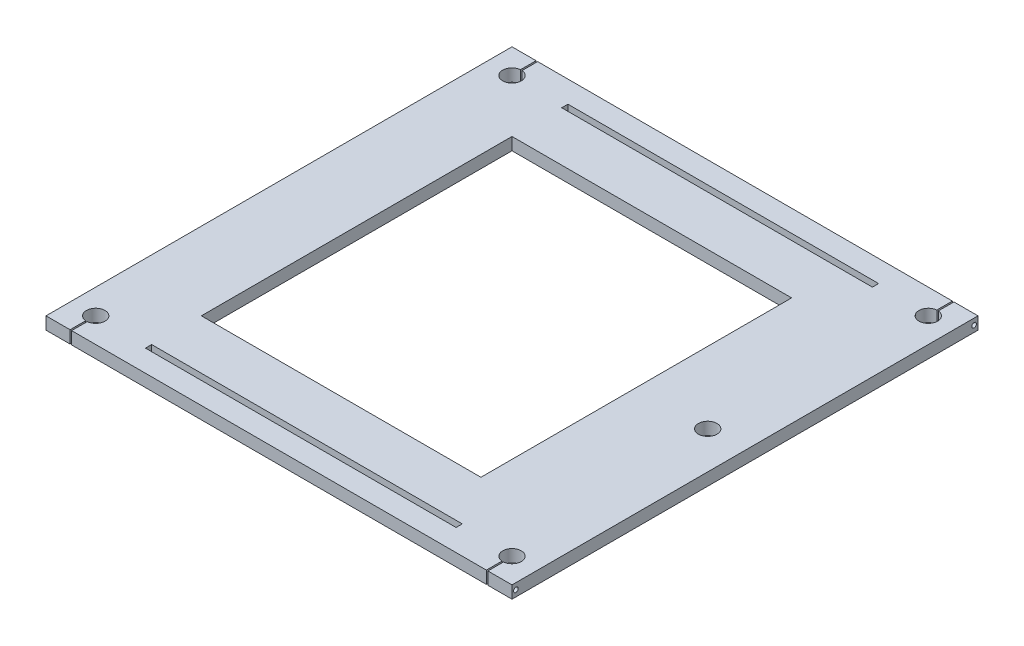
ISO-10303-21;
HEADER;
FILE_DESCRIPTION(('STEP AP214'),'2;1');
FILE_NAME('part.step','',(''),(''),'','','');
FILE_SCHEMA(('AUTOMOTIVE_DESIGN { 1 0 10303 214 1 1 1 1 }'));
ENDSEC;
DATA;
#1=APPLICATION_CONTEXT('core data for automotive mechanical design processes');
#2=APPLICATION_PROTOCOL_DEFINITION('international standard','automotive_design',2000,#1);
#3=PRODUCT_CONTEXT('',#1,'mechanical');
#4=PRODUCT('Part','Part','',(#3));
#5=PRODUCT_RELATED_PRODUCT_CATEGORY('part','',(#4));
#6=PRODUCT_DEFINITION_FORMATION('','',#4);
#7=PRODUCT_DEFINITION_CONTEXT('part definition',#1,'design');
#8=PRODUCT_DEFINITION('design','',#6,#7);
#9=PRODUCT_DEFINITION_SHAPE('','',#8);
#10=(LENGTH_UNIT() NAMED_UNIT(*) SI_UNIT(.MILLI.,.METRE.));
#11=(NAMED_UNIT(*) PLANE_ANGLE_UNIT() SI_UNIT($,.RADIAN.));
#12=(NAMED_UNIT(*) SI_UNIT($,.STERADIAN.) SOLID_ANGLE_UNIT());
#13=UNCERTAINTY_MEASURE_WITH_UNIT(LENGTH_MEASURE(1.E-05),#10,'distance_accuracy_value','');
#14=(GEOMETRIC_REPRESENTATION_CONTEXT(3) GLOBAL_UNCERTAINTY_ASSIGNED_CONTEXT((#13)) GLOBAL_UNIT_ASSIGNED_CONTEXT((#10,
#11,#12)) REPRESENTATION_CONTEXT('',''));
#15=CARTESIAN_POINT('',(0.,0.,0.));
#16=DIRECTION('',(0.,0.,1.));
#17=DIRECTION('',(1.,0.,0.));
#18=AXIS2_PLACEMENT_3D('',#15,#16,#17);
#19=CARTESIAN_POINT('',(0.,8.,0.));
#20=DIRECTION('',(0.,-1.,0.));
#21=DIRECTION('',(0.,0.,-1.));
#22=AXIS2_PLACEMENT_3D('',#19,#20,#21);
#23=PLANE('',#22);
#24=DIRECTION('',(1.,0.,0.));
#25=VECTOR('',#24,1.);
#26=CARTESIAN_POINT('',(-99.9999999999999,8.,132.));
#27=LINE('',#26,#25);
#28=CARTESIAN_POINT('',(-99.9999999999999,8.,132.));
#29=VERTEX_POINT('',#28);
#30=CARTESIAN_POINT('',(100.,8.,132.));
#31=VERTEX_POINT('',#30);
#32=EDGE_CURVE('E248',#29,#31,#27,.T.);
#33=ORIENTED_EDGE('',*,*,#32,.T.);
#34=DIRECTION('',(0.,0.,1.));
#35=VECTOR('',#34,1.);
#36=CARTESIAN_POINT('',(100.,8.,136.));
#37=LINE('',#36,#35);
#38=CARTESIAN_POINT('',(100.,8.,136.));
#39=VERTEX_POINT('',#38);
#40=EDGE_CURVE('E255',#31,#39,#37,.T.);
#41=ORIENTED_EDGE('',*,*,#40,.T.);
#42=DIRECTION('',(-1.,0.,0.));
#43=VECTOR('',#42,1.);
#44=CARTESIAN_POINT('',(-99.9999999999999,8.,136.));
#45=LINE('',#44,#43);
#46=CARTESIAN_POINT('',(-99.9999999999999,8.,136.));
#47=VERTEX_POINT('',#46);
#48=EDGE_CURVE('E265',#39,#47,#45,.T.);
#49=ORIENTED_EDGE('',*,*,#48,.T.);
#50=DIRECTION('',(0.,0.,-1.));
#51=VECTOR('',#50,1.);
#52=CARTESIAN_POINT('',(-99.9999999999999,8.,136.));
#53=LINE('',#52,#51);
#54=EDGE_CURVE('E50',#47,#29,#53,.T.);
#55=ORIENTED_EDGE('',*,*,#54,.T.);
#56=EDGE_LOOP('',(#33,#41,#49,#55));
#57=FACE_BOUND('',#56,.T.);
#58=DIRECTION('',(0.,0.,-1.));
#59=VECTOR('',#58,1.);
#60=CARTESIAN_POINT('',(-133.5,8.,150.));
#61=LINE('',#60,#59);
#62=CARTESIAN_POINT('',(-133.5,8.,150.));
#63=VERTEX_POINT('',#62);
#64=CARTESIAN_POINT('',(-133.5,8.,139.979130371551));
#65=VERTEX_POINT('',#64);
#66=EDGE_CURVE('E313',#63,#65,#61,.T.);
#67=ORIENTED_EDGE('',*,*,#66,.F.);
#68=DIRECTION('',(1.,0.,0.));
#69=VECTOR('',#68,1.);
#70=CARTESIAN_POINT('',(-150.,8.,150.));
#71=LINE('',#70,#69);
#72=CARTESIAN_POINT('',(133.5,8.,150.));
#73=VERTEX_POINT('',#72);
#74=EDGE_CURVE('E478',#63,#73,#71,.T.);
#75=ORIENTED_EDGE('',*,*,#74,.T.);
#76=DIRECTION('',(0.,0.,-1.));
#77=VECTOR('',#76,1.);
#78=CARTESIAN_POINT('',(133.5,8.,150.));
#79=LINE('',#78,#77);
#80=CARTESIAN_POINT('',(133.5,8.,139.979130371551));
#81=VERTEX_POINT('',#80);
#82=EDGE_CURVE('E378',#73,#81,#79,.T.);
#83=ORIENTED_EDGE('',*,*,#82,.T.);
#84=CARTESIAN_POINT('',(134.,8.,134.));
#85=DIRECTION('',(0.,-1.,0.));
#86=DIRECTION('',(0.,0.,-1.));
#87=AXIS2_PLACEMENT_3D('',#84,#85,#86);
#88=CIRCLE('',#87,6.00000000000001);
#89=CARTESIAN_POINT('',(134.5,8.,139.979130371551));
#90=VERTEX_POINT('',#89);
#91=EDGE_CURVE('E385',#81,#90,#88,.T.);
#92=ORIENTED_EDGE('',*,*,#91,.T.);
#93=DIRECTION('',(0.,0.,1.));
#94=VECTOR('',#93,1.);
#95=CARTESIAN_POINT('',(134.5,8.,150.));
#96=LINE('',#95,#94);
#97=CARTESIAN_POINT('',(134.5,8.,150.));
#98=VERTEX_POINT('',#97);
#99=EDGE_CURVE('E381',#90,#98,#96,.T.);
#100=ORIENTED_EDGE('',*,*,#99,.T.);
#101=CARTESIAN_POINT('',(150.,8.,150.));
#102=VERTEX_POINT('',#101);
#103=EDGE_CURVE('E473',#98,#102,#71,.T.);
#104=ORIENTED_EDGE('',*,*,#103,.T.);
#105=DIRECTION('',(0.,0.,-1.));
#106=VECTOR('',#105,1.);
#107=CARTESIAN_POINT('',(150.,8.,-150.));
#108=LINE('',#107,#106);
#109=CARTESIAN_POINT('',(150.,8.,-150.));
#110=VERTEX_POINT('',#109);
#111=EDGE_CURVE('E477',#102,#110,#108,.T.);
#112=ORIENTED_EDGE('',*,*,#111,.T.);
#113=DIRECTION('',(-1.,0.,0.));
#114=VECTOR('',#113,1.);
#115=CARTESIAN_POINT('',(-150.,8.,-150.));
#116=LINE('',#115,#114);
#117=CARTESIAN_POINT('',(134.5,8.,-150.));
#118=VERTEX_POINT('',#117);
#119=EDGE_CURVE('E466',#110,#118,#116,.T.);
#120=ORIENTED_EDGE('',*,*,#119,.T.);
#121=DIRECTION('',(0.,0.,-1.));
#122=VECTOR('',#121,1.);
#123=CARTESIAN_POINT('',(134.5,8.,-150.));
#124=LINE('',#123,#122);
#125=CARTESIAN_POINT('',(134.5,8.,-139.979130371551));
#126=VERTEX_POINT('',#125);
#127=EDGE_CURVE('E414',#126,#118,#124,.T.);
#128=ORIENTED_EDGE('',*,*,#127,.F.);
#129=CARTESIAN_POINT('',(134.,8.,-134.));
#130=DIRECTION('',(0.,1.,0.));
#131=DIRECTION('',(0.,0.,1.));
#132=AXIS2_PLACEMENT_3D('',#129,#130,#131);
#133=CIRCLE('',#132,6.00000000000001);
#134=CARTESIAN_POINT('',(133.5,8.,-139.979130371551));
#135=VERTEX_POINT('',#134);
#136=EDGE_CURVE('E411',#135,#126,#133,.T.);
#137=ORIENTED_EDGE('',*,*,#136,.F.);
#138=DIRECTION('',(0.,0.,1.));
#139=VECTOR('',#138,1.);
#140=CARTESIAN_POINT('',(133.5,8.,-150.));
#141=LINE('',#140,#139);
#142=CARTESIAN_POINT('',(133.5,8.,-150.));
#143=VERTEX_POINT('',#142);
#144=EDGE_CURVE('E409',#143,#135,#141,.T.);
#145=ORIENTED_EDGE('',*,*,#144,.F.);
#146=CARTESIAN_POINT('',(-133.5,8.,-150.));
#147=VERTEX_POINT('',#146);
#148=EDGE_CURVE('E470',#143,#147,#116,.T.);
#149=ORIENTED_EDGE('',*,*,#148,.T.);
#150=DIRECTION('',(0.,0.,1.));
#151=VECTOR('',#150,1.);
#152=CARTESIAN_POINT('',(-133.5,8.,-150.));
#153=LINE('',#152,#151);
#154=CARTESIAN_POINT('',(-133.5,8.,-139.979130371551));
#155=VERTEX_POINT('',#154);
#156=EDGE_CURVE('E342',#147,#155,#153,.T.);
#157=ORIENTED_EDGE('',*,*,#156,.T.);
#158=CARTESIAN_POINT('',(-134.,8.,-134.));
#159=DIRECTION('',(0.,-1.,0.));
#160=DIRECTION('',(0.,0.,1.));
#161=AXIS2_PLACEMENT_3D('',#158,#159,#160);
#162=CIRCLE('',#161,6.00000000000001);
#163=CARTESIAN_POINT('',(-134.5,8.,-139.979130371551));
#164=VERTEX_POINT('',#163);
#165=EDGE_CURVE('E349',#155,#164,#162,.T.);
#166=ORIENTED_EDGE('',*,*,#165,.T.);
#167=DIRECTION('',(0.,0.,-1.));
#168=VECTOR('',#167,1.);
#169=CARTESIAN_POINT('',(-134.5,8.,-150.));
#170=LINE('',#169,#168);
#171=CARTESIAN_POINT('',(-134.5,8.,-150.));
#172=VERTEX_POINT('',#171);
#173=EDGE_CURVE('E345',#164,#172,#170,.T.);
#174=ORIENTED_EDGE('',*,*,#173,.T.);
#175=CARTESIAN_POINT('',(-150.,8.,-150.));
#176=VERTEX_POINT('',#175);
#177=EDGE_CURVE('E471',#172,#176,#116,.T.);
#178=ORIENTED_EDGE('',*,*,#177,.T.);
#179=DIRECTION('',(0.,0.,1.));
#180=VECTOR('',#179,1.);
#181=CARTESIAN_POINT('',(-150.,8.,150.));
#182=LINE('',#181,#180);
#183=CARTESIAN_POINT('',(-150.,8.,150.));
#184=VERTEX_POINT('',#183);
#185=EDGE_CURVE('E469',#176,#184,#182,.T.);
#186=ORIENTED_EDGE('',*,*,#185,.T.);
#187=CARTESIAN_POINT('',(-134.5,8.,150.));
#188=VERTEX_POINT('',#187);
#189=EDGE_CURVE('E474',#184,#188,#71,.T.);
#190=ORIENTED_EDGE('',*,*,#189,.T.);
#191=DIRECTION('',(0.,0.,1.));
#192=VECTOR('',#191,1.);
#193=CARTESIAN_POINT('',(-134.5,8.,150.));
#194=LINE('',#193,#192);
#195=CARTESIAN_POINT('',(-134.5,8.,139.979130371551));
#196=VERTEX_POINT('',#195);
#197=EDGE_CURVE('E318',#196,#188,#194,.T.);
#198=ORIENTED_EDGE('',*,*,#197,.F.);
#199=CARTESIAN_POINT('',(-134.,8.,134.));
#200=DIRECTION('',(0.,1.,0.));
#201=DIRECTION('',(0.,0.,-1.));
#202=AXIS2_PLACEMENT_3D('',#199,#200,#201);
#203=CIRCLE('',#202,6.00000000000001);
#204=EDGE_CURVE('E315',#65,#196,#203,.T.);
#205=ORIENTED_EDGE('',*,*,#204,.F.);
#206=EDGE_LOOP('',(#67,#75,#83,#92,#100,#104,#112,#120,#128,#137,#145,#149,#157,#166,#174,#178,
#186,#190,#198,#205));
#207=FACE_BOUND('',#206,.T.);
#208=DIRECTION('',(0.,0.,-1.));
#209=VECTOR('',#208,1.);
#210=CARTESIAN_POINT('',(80.,8.,100.));
#211=LINE('',#210,#209);
#212=CARTESIAN_POINT('',(80.,8.,100.));
#213=VERTEX_POINT('',#212);
#214=CARTESIAN_POINT('',(80.,8.,-100.));
#215=VERTEX_POINT('',#214);
#216=EDGE_CURVE('E435',#213,#215,#211,.T.);
#217=ORIENTED_EDGE('',*,*,#216,.F.);
#218=DIRECTION('',(1.,0.,0.));
#219=VECTOR('',#218,1.);
#220=CARTESIAN_POINT('',(-99.9999999999999,8.,100.));
#221=LINE('',#220,#219);
#222=CARTESIAN_POINT('',(-99.9999999999999,8.,100.));
#223=VERTEX_POINT('',#222);
#224=EDGE_CURVE('E443',#223,#213,#221,.T.);
#225=ORIENTED_EDGE('',*,*,#224,.F.);
#226=DIRECTION('',(0.,0.,1.));
#227=VECTOR('',#226,1.);
#228=CARTESIAN_POINT('',(-99.9999999999999,8.,100.));
#229=LINE('',#228,#227);
#230=CARTESIAN_POINT('',(-99.9999999999999,8.,-100.));
#231=VERTEX_POINT('',#230);
#232=EDGE_CURVE('E440',#231,#223,#229,.T.);
#233=ORIENTED_EDGE('',*,*,#232,.F.);
#234=DIRECTION('',(-1.,0.,0.));
#235=VECTOR('',#234,1.);
#236=CARTESIAN_POINT('',(-99.9999999999999,8.,-100.));
#237=LINE('',#236,#235);
#238=EDGE_CURVE('E437',#215,#231,#237,.T.);
#239=ORIENTED_EDGE('',*,*,#238,.F.);
#240=EDGE_LOOP('',(#217,#225,#233,#239));
#241=FACE_BOUND('',#240,.T.);
#242=CARTESIAN_POINT('',(126.,8.,0.));
#243=DIRECTION('',(0.,1.,0.));
#244=DIRECTION('',(0.,0.,1.));
#245=AXIS2_PLACEMENT_3D('',#242,#243,#244);
#246=CIRCLE('',#245,6.00000000000004);
#247=CARTESIAN_POINT('',(126.,8.,6.00000000000004));
#248=VERTEX_POINT('',#247);
#249=EDGE_CURVE('E369',#248,#248,#246,.T.);
#250=ORIENTED_EDGE('',*,*,#249,.F.);
#251=EDGE_LOOP('',(#250));
#252=FACE_BOUND('',#251,.T.);
#253=DIRECTION('',(0.,0.,-1.));
#254=VECTOR('',#253,1.);
#255=CARTESIAN_POINT('',(100.,8.,-136.));
#256=LINE('',#255,#254);
#257=CARTESIAN_POINT('',(100.,8.,-132.));
#258=VERTEX_POINT('',#257);
#259=CARTESIAN_POINT('',(100.,8.,-136.));
#260=VERTEX_POINT('',#259);
#261=EDGE_CURVE('E280',#258,#260,#256,.T.);
#262=ORIENTED_EDGE('',*,*,#261,.F.);
#263=DIRECTION('',(1.,0.,0.));
#264=VECTOR('',#263,1.);
#265=CARTESIAN_POINT('',(-99.9999999999999,8.,-132.));
#266=LINE('',#265,#264);
#267=CARTESIAN_POINT('',(-99.9999999999999,8.,-132.));
#268=VERTEX_POINT('',#267);
#269=EDGE_CURVE('E288',#268,#258,#266,.T.);
#270=ORIENTED_EDGE('',*,*,#269,.F.);
#271=DIRECTION('',(0.,0.,1.));
#272=VECTOR('',#271,1.);
#273=CARTESIAN_POINT('',(-99.9999999999999,8.,-136.));
#274=LINE('',#273,#272);
#275=CARTESIAN_POINT('',(-99.9999999999999,8.,-136.));
#276=VERTEX_POINT('',#275);
#277=EDGE_CURVE('E285',#276,#268,#274,.T.);
#278=ORIENTED_EDGE('',*,*,#277,.F.);
#279=DIRECTION('',(-1.,0.,0.));
#280=VECTOR('',#279,1.);
#281=CARTESIAN_POINT('',(-99.9999999999999,8.,-136.));
#282=LINE('',#281,#280);
#283=EDGE_CURVE('E282',#260,#276,#282,.T.);
#284=ORIENTED_EDGE('',*,*,#283,.F.);
#285=EDGE_LOOP('',(#262,#270,#278,#284));
#286=FACE_BOUND('',#285,.T.);
#287=ADVANCED_FACE('F33',(#57,#207,#241,#252,#286),#23,.F.);
#288=CARTESIAN_POINT('',(0.,0.,0.));
#289=DIRECTION('',(0.,-1.,0.));
#290=DIRECTION('',(0.,0.,-1.));
#291=AXIS2_PLACEMENT_3D('',#288,#289,#290);
#292=PLANE('',#291);
#293=DIRECTION('',(0.,0.,1.));
#294=VECTOR('',#293,1.);
#295=CARTESIAN_POINT('',(100.,0.,136.));
#296=LINE('',#295,#294);
#297=CARTESIAN_POINT('',(100.,0.,132.));
#298=VERTEX_POINT('',#297);
#299=CARTESIAN_POINT('',(100.,0.,136.));
#300=VERTEX_POINT('',#299);
#301=EDGE_CURVE('E58',#298,#300,#296,.T.);
#302=ORIENTED_EDGE('',*,*,#301,.F.);
#303=DIRECTION('',(1.,0.,0.));
#304=VECTOR('',#303,1.);
#305=CARTESIAN_POINT('',(-99.9999999999999,0.,132.));
#306=LINE('',#305,#304);
#307=CARTESIAN_POINT('',(-99.9999999999999,0.,132.));
#308=VERTEX_POINT('',#307);
#309=EDGE_CURVE('E250',#308,#298,#306,.T.);
#310=ORIENTED_EDGE('',*,*,#309,.F.);
#311=DIRECTION('',(0.,0.,-1.));
#312=VECTOR('',#311,1.);
#313=CARTESIAN_POINT('',(-99.9999999999999,0.,136.));
#314=LINE('',#313,#312);
#315=CARTESIAN_POINT('',(-99.9999999999999,0.,136.));
#316=VERTEX_POINT('',#315);
#317=EDGE_CURVE('E271',#316,#308,#314,.T.);
#318=ORIENTED_EDGE('',*,*,#317,.F.);
#319=DIRECTION('',(-1.,0.,0.));
#320=VECTOR('',#319,1.);
#321=CARTESIAN_POINT('',(-99.9999999999999,0.,136.));
#322=LINE('',#321,#320);
#323=EDGE_CURVE('E261',#300,#316,#322,.T.);
#324=ORIENTED_EDGE('',*,*,#323,.F.);
#325=EDGE_LOOP('',(#302,#310,#318,#324));
#326=FACE_BOUND('',#325,.T.);
#327=DIRECTION('',(1.,0.,0.));
#328=VECTOR('',#327,1.);
#329=CARTESIAN_POINT('',(-150.,0.,150.));
#330=LINE('',#329,#328);
#331=CARTESIAN_POINT('',(-133.5,0.,150.));
#332=VERTEX_POINT('',#331);
#333=CARTESIAN_POINT('',(133.5,0.,150.));
#334=VERTEX_POINT('',#333);
#335=EDGE_CURVE('E492',#332,#334,#330,.T.);
#336=ORIENTED_EDGE('',*,*,#335,.F.);
#337=DIRECTION('',(0.,0.,-1.));
#338=VECTOR('',#337,1.);
#339=CARTESIAN_POINT('',(-133.5,0.,150.));
#340=LINE('',#339,#338);
#341=CARTESIAN_POINT('',(-133.5,0.,139.979130371551));
#342=VERTEX_POINT('',#341);
#343=EDGE_CURVE('E321',#332,#342,#340,.T.);
#344=ORIENTED_EDGE('',*,*,#343,.T.);
#345=CARTESIAN_POINT('',(-134.,0.,134.));
#346=DIRECTION('',(0.,1.,0.));
#347=DIRECTION('',(0.,0.,-1.));
#348=AXIS2_PLACEMENT_3D('',#345,#346,#347);
#349=CIRCLE('',#348,6.00000000000001);
#350=CARTESIAN_POINT('',(-134.5,0.,139.979130371551));
#351=VERTEX_POINT('',#350);
#352=EDGE_CURVE('E324',#342,#351,#349,.T.);
#353=ORIENTED_EDGE('',*,*,#352,.T.);
#354=DIRECTION('',(0.,0.,1.));
#355=VECTOR('',#354,1.);
#356=CARTESIAN_POINT('',(-134.5,0.,150.));
#357=LINE('',#356,#355);
#358=CARTESIAN_POINT('',(-134.5,0.,150.));
#359=VERTEX_POINT('',#358);
#360=EDGE_CURVE('E316',#351,#359,#357,.T.);
#361=ORIENTED_EDGE('',*,*,#360,.T.);
#362=CARTESIAN_POINT('',(-150.,0.,150.));
#363=VERTEX_POINT('',#362);
#364=EDGE_CURVE('E488',#363,#359,#330,.T.);
#365=ORIENTED_EDGE('',*,*,#364,.F.);
#366=DIRECTION('',(0.,0.,1.));
#367=VECTOR('',#366,1.);
#368=CARTESIAN_POINT('',(-150.,0.,150.));
#369=LINE('',#368,#367);
#370=CARTESIAN_POINT('',(-150.,0.,-150.));
#371=VERTEX_POINT('',#370);
#372=EDGE_CURVE('E484',#371,#363,#369,.T.);
#373=ORIENTED_EDGE('',*,*,#372,.F.);
#374=DIRECTION('',(-1.,0.,0.));
#375=VECTOR('',#374,1.);
#376=CARTESIAN_POINT('',(-150.,0.,-150.));
#377=LINE('',#376,#375);
#378=CARTESIAN_POINT('',(-134.5,0.,-150.));
#379=VERTEX_POINT('',#378);
#380=EDGE_CURVE('E465',#379,#371,#377,.T.);
#381=ORIENTED_EDGE('',*,*,#380,.F.);
#382=DIRECTION('',(0.,0.,-1.));
#383=VECTOR('',#382,1.);
#384=CARTESIAN_POINT('',(-134.5,0.,-150.));
#385=LINE('',#384,#383);
#386=CARTESIAN_POINT('',(-134.5,0.,-139.979130371551));
#387=VERTEX_POINT('',#386);
#388=EDGE_CURVE('E356',#387,#379,#385,.T.);
#389=ORIENTED_EDGE('',*,*,#388,.F.);
#390=CARTESIAN_POINT('',(-134.,0.,-134.));
#391=DIRECTION('',(0.,-1.,0.));
#392=DIRECTION('',(0.,0.,1.));
#393=AXIS2_PLACEMENT_3D('',#390,#391,#392);
#394=CIRCLE('',#393,6.00000000000001);
#395=CARTESIAN_POINT('',(-133.5,0.,-139.979130371551));
#396=VERTEX_POINT('',#395);
#397=EDGE_CURVE('E346',#396,#387,#394,.T.);
#398=ORIENTED_EDGE('',*,*,#397,.F.);
#399=DIRECTION('',(0.,0.,1.));
#400=VECTOR('',#399,1.);
#401=CARTESIAN_POINT('',(-133.5,0.,-150.));
#402=LINE('',#401,#400);
#403=CARTESIAN_POINT('',(-133.5,0.,-150.));
#404=VERTEX_POINT('',#403);
#405=EDGE_CURVE('E353',#404,#396,#402,.T.);
#406=ORIENTED_EDGE('',*,*,#405,.F.);
#407=CARTESIAN_POINT('',(133.5,0.,-150.));
#408=VERTEX_POINT('',#407);
#409=EDGE_CURVE('E485',#408,#404,#377,.T.);
#410=ORIENTED_EDGE('',*,*,#409,.F.);
#411=DIRECTION('',(0.,0.,1.));
#412=VECTOR('',#411,1.);
#413=CARTESIAN_POINT('',(133.5,0.,-150.));
#414=LINE('',#413,#412);
#415=CARTESIAN_POINT('',(133.5,0.,-139.979130371551));
#416=VERTEX_POINT('',#415);
#417=EDGE_CURVE('E417',#408,#416,#414,.T.);
#418=ORIENTED_EDGE('',*,*,#417,.T.);
#419=CARTESIAN_POINT('',(134.,0.,-134.));
#420=DIRECTION('',(0.,1.,0.));
#421=DIRECTION('',(0.,0.,1.));
#422=AXIS2_PLACEMENT_3D('',#419,#420,#421);
#423=CIRCLE('',#422,6.00000000000001);
#424=CARTESIAN_POINT('',(134.5,0.,-139.979130371551));
#425=VERTEX_POINT('',#424);
#426=EDGE_CURVE('E420',#416,#425,#423,.T.);
#427=ORIENTED_EDGE('',*,*,#426,.T.);
#428=DIRECTION('',(0.,0.,-1.));
#429=VECTOR('',#428,1.);
#430=CARTESIAN_POINT('',(134.5,0.,-150.));
#431=LINE('',#430,#429);
#432=CARTESIAN_POINT('',(134.5,0.,-150.));
#433=VERTEX_POINT('',#432);
#434=EDGE_CURVE('E412',#425,#433,#431,.T.);
#435=ORIENTED_EDGE('',*,*,#434,.T.);
#436=CARTESIAN_POINT('',(150.,0.,-150.));
#437=VERTEX_POINT('',#436);
#438=EDGE_CURVE('E481',#437,#433,#377,.T.);
#439=ORIENTED_EDGE('',*,*,#438,.F.);
#440=DIRECTION('',(0.,0.,-1.));
#441=VECTOR('',#440,1.);
#442=CARTESIAN_POINT('',(150.,0.,-150.));
#443=LINE('',#442,#441);
#444=CARTESIAN_POINT('',(150.,0.,150.));
#445=VERTEX_POINT('',#444);
#446=EDGE_CURVE('E491',#445,#437,#443,.T.);
#447=ORIENTED_EDGE('',*,*,#446,.F.);
#448=CARTESIAN_POINT('',(134.5,0.,150.));
#449=VERTEX_POINT('',#448);
#450=EDGE_CURVE('E487',#449,#445,#330,.T.);
#451=ORIENTED_EDGE('',*,*,#450,.F.);
#452=DIRECTION('',(0.,0.,1.));
#453=VECTOR('',#452,1.);
#454=CARTESIAN_POINT('',(134.5,0.,150.));
#455=LINE('',#454,#453);
#456=CARTESIAN_POINT('',(134.5,0.,139.979130371551));
#457=VERTEX_POINT('',#456);
#458=EDGE_CURVE('E392',#457,#449,#455,.T.);
#459=ORIENTED_EDGE('',*,*,#458,.F.);
#460=CARTESIAN_POINT('',(134.,0.,134.));
#461=DIRECTION('',(0.,-1.,0.));
#462=DIRECTION('',(0.,0.,-1.));
#463=AXIS2_PLACEMENT_3D('',#460,#461,#462);
#464=CIRCLE('',#463,6.00000000000001);
#465=CARTESIAN_POINT('',(133.5,0.,139.979130371551));
#466=VERTEX_POINT('',#465);
#467=EDGE_CURVE('E382',#466,#457,#464,.T.);
#468=ORIENTED_EDGE('',*,*,#467,.F.);
#469=DIRECTION('',(0.,0.,-1.));
#470=VECTOR('',#469,1.);
#471=CARTESIAN_POINT('',(133.5,0.,150.));
#472=LINE('',#471,#470);
#473=EDGE_CURVE('E389',#334,#466,#472,.T.);
#474=ORIENTED_EDGE('',*,*,#473,.F.);
#475=EDGE_LOOP('',(#336,#344,#353,#361,#365,#373,#381,#389,#398,#406,#410,#418,#427,#435,#439,
#447,#451,#459,#468,#474));
#476=FACE_BOUND('',#475,.T.);
#477=DIRECTION('',(1.,0.,0.));
#478=VECTOR('',#477,1.);
#479=CARTESIAN_POINT('',(-99.9999999999999,0.,100.));
#480=LINE('',#479,#478);
#481=CARTESIAN_POINT('',(-99.9999999999999,0.,100.));
#482=VERTEX_POINT('',#481);
#483=CARTESIAN_POINT('',(80.,0.,100.));
#484=VERTEX_POINT('',#483);
#485=EDGE_CURVE('E438',#482,#484,#480,.T.);
#486=ORIENTED_EDGE('',*,*,#485,.T.);
#487=DIRECTION('',(0.,0.,-1.));
#488=VECTOR('',#487,1.);
#489=CARTESIAN_POINT('',(80.,0.,100.));
#490=LINE('',#489,#488);
#491=CARTESIAN_POINT('',(80.,0.,-100.));
#492=VERTEX_POINT('',#491);
#493=EDGE_CURVE('E434',#484,#492,#490,.T.);
#494=ORIENTED_EDGE('',*,*,#493,.T.);
#495=DIRECTION('',(-1.,0.,0.));
#496=VECTOR('',#495,1.);
#497=CARTESIAN_POINT('',(-99.9999999999999,0.,-100.));
#498=LINE('',#497,#496);
#499=CARTESIAN_POINT('',(-99.9999999999999,0.,-100.));
#500=VERTEX_POINT('',#499);
#501=EDGE_CURVE('E448',#492,#500,#498,.T.);
#502=ORIENTED_EDGE('',*,*,#501,.T.);
#503=DIRECTION('',(0.,0.,1.));
#504=VECTOR('',#503,1.);
#505=CARTESIAN_POINT('',(-99.9999999999999,0.,100.));
#506=LINE('',#505,#504);
#507=EDGE_CURVE('E451',#500,#482,#506,.T.);
#508=ORIENTED_EDGE('',*,*,#507,.T.);
#509=EDGE_LOOP('',(#486,#494,#502,#508));
#510=FACE_BOUND('',#509,.T.);
#511=CARTESIAN_POINT('',(126.,0.,0.));
#512=DIRECTION('',(0.,1.,0.));
#513=DIRECTION('',(0.,0.,1.));
#514=AXIS2_PLACEMENT_3D('',#511,#512,#513);
#515=CIRCLE('',#514,6.00000000000004);
#516=CARTESIAN_POINT('',(126.,0.,6.00000000000004));
#517=VERTEX_POINT('',#516);
#518=EDGE_CURVE('E368',#517,#517,#515,.T.);
#519=ORIENTED_EDGE('',*,*,#518,.T.);
#520=EDGE_LOOP('',(#519));
#521=FACE_BOUND('',#520,.T.);
#522=DIRECTION('',(1.,0.,0.));
#523=VECTOR('',#522,1.);
#524=CARTESIAN_POINT('',(-99.9999999999999,0.,-132.));
#525=LINE('',#524,#523);
#526=CARTESIAN_POINT('',(-99.9999999999999,0.,-132.));
#527=VERTEX_POINT('',#526);
#528=CARTESIAN_POINT('',(100.,0.,-132.));
#529=VERTEX_POINT('',#528);
#530=EDGE_CURVE('E283',#527,#529,#525,.T.);
#531=ORIENTED_EDGE('',*,*,#530,.T.);
#532=DIRECTION('',(0.,0.,-1.));
#533=VECTOR('',#532,1.);
#534=CARTESIAN_POINT('',(100.,0.,-136.));
#535=LINE('',#534,#533);
#536=CARTESIAN_POINT('',(100.,0.,-136.));
#537=VERTEX_POINT('',#536);
#538=EDGE_CURVE('E251',#529,#537,#535,.T.);
#539=ORIENTED_EDGE('',*,*,#538,.T.);
#540=DIRECTION('',(-1.,0.,0.));
#541=VECTOR('',#540,1.);
#542=CARTESIAN_POINT('',(-99.9999999999999,0.,-136.));
#543=LINE('',#542,#541);
#544=CARTESIAN_POINT('',(-99.9999999999999,0.,-136.));
#545=VERTEX_POINT('',#544);
#546=EDGE_CURVE('E293',#537,#545,#543,.T.);
#547=ORIENTED_EDGE('',*,*,#546,.T.);
#548=DIRECTION('',(0.,0.,1.));
#549=VECTOR('',#548,1.);
#550=CARTESIAN_POINT('',(-99.9999999999999,0.,-136.));
#551=LINE('',#550,#549);
#552=EDGE_CURVE('E296',#545,#527,#551,.T.);
#553=ORIENTED_EDGE('',*,*,#552,.T.);
#554=EDGE_LOOP('',(#531,#539,#547,#553));
#555=FACE_BOUND('',#554,.T.);
#556=ADVANCED_FACE('F527',(#326,#476,#510,#521,#555),#292,.T.);
#557=CARTESIAN_POINT('',(-150.,8.,150.));
#558=DIRECTION('',(0.,0.,-1.));
#559=DIRECTION('',(-1.,0.,0.));
#560=AXIS2_PLACEMENT_3D('',#557,#558,#559);
#561=PLANE('',#560);
#562=DIRECTION('',(0.,-1.,0.));
#563=VECTOR('',#562,1.);
#564=CARTESIAN_POINT('',(-133.5,8.,150.));
#565=LINE('',#564,#563);
#566=EDGE_CURVE('E320',#63,#332,#565,.T.);
#567=ORIENTED_EDGE('',*,*,#566,.T.);
#568=ORIENTED_EDGE('',*,*,#335,.T.);
#569=DIRECTION('',(0.,-1.,0.));
#570=VECTOR('',#569,1.);
#571=CARTESIAN_POINT('',(133.5,8.,150.));
#572=LINE('',#571,#570);
#573=EDGE_CURVE('E402',#73,#334,#572,.T.);
#574=ORIENTED_EDGE('',*,*,#573,.F.);
#575=ORIENTED_EDGE('',*,*,#74,.F.);
#576=EDGE_LOOP('',(#567,#568,#574,#575));
#577=FACE_BOUND('',#576,.T.);
#578=ADVANCED_FACE('F532',(#577),#561,.F.);
#579=DIRECTION('',(0.,-1.,0.));
#580=VECTOR('',#579,1.);
#581=CARTESIAN_POINT('',(-134.5,8.,150.));
#582=LINE('',#581,#580);
#583=EDGE_CURVE('E331',#188,#359,#582,.T.);
#584=ORIENTED_EDGE('',*,*,#583,.F.);
#585=ORIENTED_EDGE('',*,*,#189,.F.);
#586=DIRECTION('',(0.,-1.,0.));
#587=VECTOR('',#586,1.);
#588=CARTESIAN_POINT('',(-150.,8.,150.));
#589=LINE('',#588,#587);
#590=EDGE_CURVE('E42',#184,#363,#589,.T.);
#591=ORIENTED_EDGE('',*,*,#590,.T.);
#592=ORIENTED_EDGE('',*,*,#364,.T.);
#593=EDGE_LOOP('',(#584,#585,#591,#592));
#594=FACE_BOUND('',#593,.T.);
#595=ADVANCED_FACE('F522',(#594),#561,.F.);
#596=CARTESIAN_POINT('',(-150.,8.,150.));
#597=DIRECTION('',(1.,0.,0.));
#598=DIRECTION('',(0.,0.,-1.));
#599=AXIS2_PLACEMENT_3D('',#596,#597,#598);
#600=PLANE('',#599);
#601=CARTESIAN_POINT('',(-150.,4.,147.5));
#602=DIRECTION('',(-1.,0.,0.));
#603=DIRECTION('',(0.,0.,1.));
#604=AXIS2_PLACEMENT_3D('',#601,#602,#603);
#605=CIRCLE('',#604,1.5);
#606=CARTESIAN_POINT('',(-150.,4.,149.));
#607=VERTEX_POINT('',#606);
#608=EDGE_CURVE('E310',#607,#607,#605,.T.);
#609=ORIENTED_EDGE('',*,*,#608,.F.);
#610=EDGE_LOOP('',(#609));
#611=FACE_BOUND('',#610,.T.);
#612=ORIENTED_EDGE('',*,*,#372,.T.);
#613=ORIENTED_EDGE('',*,*,#590,.F.);
#614=ORIENTED_EDGE('',*,*,#185,.F.);
#615=DIRECTION('',(0.,-1.,0.));
#616=VECTOR('',#615,1.);
#617=CARTESIAN_POINT('',(-150.,8.,-150.));
#618=LINE('',#617,#616);
#619=EDGE_CURVE('E11',#176,#371,#618,.T.);
#620=ORIENTED_EDGE('',*,*,#619,.T.);
#621=EDGE_LOOP('',(#612,#613,#614,#620));
#622=FACE_BOUND('',#621,.T.);
#623=CARTESIAN_POINT('',(-150.,4.,-147.5));
#624=DIRECTION('',(1.,0.,0.));
#625=DIRECTION('',(0.,0.,-1.));
#626=AXIS2_PLACEMENT_3D('',#623,#624,#625);
#627=CIRCLE('',#626,1.5);
#628=CARTESIAN_POINT('',(-150.,4.,-149.));
#629=VERTEX_POINT('',#628);
#630=EDGE_CURVE('E338',#629,#629,#627,.T.);
#631=ORIENTED_EDGE('',*,*,#630,.T.);
#632=EDGE_LOOP('',(#631));
#633=FACE_BOUND('',#632,.T.);
#634=ADVANCED_FACE('F512',(#611,#622,#633),#600,.F.);
#635=CARTESIAN_POINT('',(-134.5,8.,-150.));
#636=DIRECTION('',(-1.,0.,0.));
#637=DIRECTION('',(0.,0.,1.));
#638=AXIS2_PLACEMENT_3D('',#635,#636,#637);
#639=PLANE('',#638);
#640=ORIENTED_EDGE('',*,*,#388,.T.);
#641=DIRECTION('',(0.,-1.,0.));
#642=VECTOR('',#641,1.);
#643=CARTESIAN_POINT('',(-134.5,8.,-150.));
#644=LINE('',#643,#642);
#645=EDGE_CURVE('E363',#172,#379,#644,.T.);
#646=ORIENTED_EDGE('',*,*,#645,.F.);
#647=ORIENTED_EDGE('',*,*,#173,.F.);
#648=DIRECTION('',(0.,-1.,0.));
#649=VECTOR('',#648,1.);
#650=CARTESIAN_POINT('',(-134.5,8.,-139.979130371551));
#651=LINE('',#650,#649);
#652=EDGE_CURVE('E361',#164,#387,#651,.T.);
#653=ORIENTED_EDGE('',*,*,#652,.T.);
#654=EDGE_LOOP('',(#640,#646,#647,#653));
#655=FACE_BOUND('',#654,.T.);
#656=CARTESIAN_POINT('',(-134.5,4.,-147.5));
#657=DIRECTION('',(-1.,0.,0.));
#658=DIRECTION('',(0.,0.,1.));
#659=AXIS2_PLACEMENT_3D('',#656,#657,#658);
#660=CIRCLE('',#659,1.5);
#661=CARTESIAN_POINT('',(-134.5,4.,-146.));
#662=VERTEX_POINT('',#661);
#663=EDGE_CURVE('E341',#662,#662,#660,.F.);
#664=ORIENTED_EDGE('',*,*,#663,.F.);
#665=EDGE_LOOP('',(#664));
#666=FACE_BOUND('',#665,.T.);
#667=ADVANCED_FACE('F509',(#655,#666),#639,.F.);
#668=CARTESIAN_POINT('',(-150.,8.,-150.));
#669=DIRECTION('',(0.,0.,1.));
#670=DIRECTION('',(1.,0.,0.));
#671=AXIS2_PLACEMENT_3D('',#668,#669,#670);
#672=PLANE('',#671);
#673=ORIENTED_EDGE('',*,*,#409,.T.);
#674=DIRECTION('',(0.,-1.,0.));
#675=VECTOR('',#674,1.);
#676=CARTESIAN_POINT('',(-133.5,8.,-150.));
#677=LINE('',#676,#675);
#678=EDGE_CURVE('E366',#147,#404,#677,.T.);
#679=ORIENTED_EDGE('',*,*,#678,.F.);
#680=ORIENTED_EDGE('',*,*,#148,.F.);
#681=DIRECTION('',(0.,-1.,0.));
#682=VECTOR('',#681,1.);
#683=CARTESIAN_POINT('',(133.5,8.,-150.));
#684=LINE('',#683,#682);
#685=EDGE_CURVE('E416',#143,#408,#684,.T.);
#686=ORIENTED_EDGE('',*,*,#685,.T.);
#687=EDGE_LOOP('',(#673,#679,#680,#686));
#688=FACE_BOUND('',#687,.T.);
#689=ADVANCED_FACE('F511',(#688),#672,.F.);
#690=CARTESIAN_POINT('',(150.,8.,-150.));
#691=DIRECTION('',(-1.,0.,0.));
#692=DIRECTION('',(0.,0.,1.));
#693=AXIS2_PLACEMENT_3D('',#690,#691,#692);
#694=PLANE('',#693);
#695=ORIENTED_EDGE('',*,*,#446,.T.);
#696=DIRECTION('',(0.,-1.,0.));
#697=VECTOR('',#696,1.);
#698=CARTESIAN_POINT('',(150.,8.,-150.));
#699=LINE('',#698,#697);
#700=EDGE_CURVE('E480',#110,#437,#699,.T.);
#701=ORIENTED_EDGE('',*,*,#700,.F.);
#702=ORIENTED_EDGE('',*,*,#111,.F.);
#703=DIRECTION('',(0.,-1.,0.));
#704=VECTOR('',#703,1.);
#705=CARTESIAN_POINT('',(150.,8.,150.));
#706=LINE('',#705,#704);
#707=EDGE_CURVE('E496',#102,#445,#706,.T.);
#708=ORIENTED_EDGE('',*,*,#707,.T.);
#709=EDGE_LOOP('',(#695,#701,#702,#708));
#710=FACE_BOUND('',#709,.T.);
#711=CARTESIAN_POINT('',(150.,4.,-147.5));
#712=DIRECTION('',(1.,0.,0.));
#713=DIRECTION('',(0.,0.,-1.));
#714=AXIS2_PLACEMENT_3D('',#711,#712,#713);
#715=CIRCLE('',#714,1.5);
#716=CARTESIAN_POINT('',(150.,4.,-149.));
#717=VERTEX_POINT('',#716);
#718=EDGE_CURVE('E405',#717,#717,#715,.T.);
#719=ORIENTED_EDGE('',*,*,#718,.F.);
#720=EDGE_LOOP('',(#719));
#721=FACE_BOUND('',#720,.T.);
#722=CARTESIAN_POINT('',(150.,4.,147.5));
#723=DIRECTION('',(-1.,0.,0.));
#724=DIRECTION('',(0.,0.,1.));
#725=AXIS2_PLACEMENT_3D('',#722,#723,#724);
#726=CIRCLE('',#725,1.5);
#727=CARTESIAN_POINT('',(150.,4.,149.));
#728=VERTEX_POINT('',#727);
#729=EDGE_CURVE('E372',#728,#728,#726,.T.);
#730=ORIENTED_EDGE('',*,*,#729,.T.);
#731=EDGE_LOOP('',(#730));
#732=FACE_BOUND('',#731,.T.);
#733=ADVANCED_FACE('F519',(#710,#721,#732),#694,.F.);
#734=CARTESIAN_POINT('',(134.5,8.,150.));
#735=DIRECTION('',(1.,0.,0.));
#736=DIRECTION('',(0.,0.,-1.));
#737=AXIS2_PLACEMENT_3D('',#734,#735,#736);
#738=PLANE('',#737);
#739=ORIENTED_EDGE('',*,*,#458,.T.);
#740=DIRECTION('',(0.,-1.,0.));
#741=VECTOR('',#740,1.);
#742=CARTESIAN_POINT('',(134.5,8.,150.));
#743=LINE('',#742,#741);
#744=EDGE_CURVE('E399',#98,#449,#743,.T.);
#745=ORIENTED_EDGE('',*,*,#744,.F.);
#746=ORIENTED_EDGE('',*,*,#99,.F.);
#747=DIRECTION('',(0.,-1.,0.));
#748=VECTOR('',#747,1.);
#749=CARTESIAN_POINT('',(134.5,8.,139.979130371551));
#750=LINE('',#749,#748);
#751=EDGE_CURVE('E397',#90,#457,#750,.T.);
#752=ORIENTED_EDGE('',*,*,#751,.T.);
#753=EDGE_LOOP('',(#739,#745,#746,#752));
#754=FACE_BOUND('',#753,.T.);
#755=CARTESIAN_POINT('',(134.5,4.,147.5));
#756=DIRECTION('',(1.,0.,0.));
#757=DIRECTION('',(0.,0.,-1.));
#758=AXIS2_PLACEMENT_3D('',#755,#756,#757);
#759=CIRCLE('',#758,1.5);
#760=CARTESIAN_POINT('',(134.5,4.,146.));
#761=VERTEX_POINT('',#760);
#762=EDGE_CURVE('E377',#761,#761,#759,.F.);
#763=ORIENTED_EDGE('',*,*,#762,.F.);
#764=EDGE_LOOP('',(#763));
#765=FACE_BOUND('',#764,.T.);
#766=ADVANCED_FACE('F541',(#754,#765),#738,.F.);
#767=ORIENTED_EDGE('',*,*,#177,.F.);
#768=ORIENTED_EDGE('',*,*,#645,.T.);
#769=ORIENTED_EDGE('',*,*,#380,.T.);
#770=ORIENTED_EDGE('',*,*,#619,.F.);
#771=EDGE_LOOP('',(#767,#768,#769,#770));
#772=FACE_BOUND('',#771,.T.);
#773=ADVANCED_FACE('F35',(#772),#672,.F.);
#774=DIRECTION('',(0.,-1.,0.));
#775=VECTOR('',#774,1.);
#776=CARTESIAN_POINT('',(134.5,8.,-150.));
#777=LINE('',#776,#775);
#778=EDGE_CURVE('E427',#118,#433,#777,.T.);
#779=ORIENTED_EDGE('',*,*,#778,.F.);
#780=ORIENTED_EDGE('',*,*,#119,.F.);
#781=ORIENTED_EDGE('',*,*,#700,.T.);
#782=ORIENTED_EDGE('',*,*,#438,.T.);
#783=EDGE_LOOP('',(#779,#780,#781,#782));
#784=FACE_BOUND('',#783,.T.);
#785=ADVANCED_FACE('F521',(#784),#672,.F.);
#786=ORIENTED_EDGE('',*,*,#103,.F.);
#787=ORIENTED_EDGE('',*,*,#744,.T.);
#788=ORIENTED_EDGE('',*,*,#450,.T.);
#789=ORIENTED_EDGE('',*,*,#707,.F.);
#790=EDGE_LOOP('',(#786,#787,#788,#789));
#791=FACE_BOUND('',#790,.T.);
#792=ADVANCED_FACE('F543',(#791),#561,.F.);
#793=CARTESIAN_POINT('',(80.,8.,100.));
#794=DIRECTION('',(-1.,0.,0.));
#795=DIRECTION('',(0.,0.,1.));
#796=AXIS2_PLACEMENT_3D('',#793,#794,#795);
#797=PLANE('',#796);
#798=ORIENTED_EDGE('',*,*,#493,.F.);
#799=DIRECTION('',(0.,-1.,0.));
#800=VECTOR('',#799,1.);
#801=CARTESIAN_POINT('',(80.,8.,100.));
#802=LINE('',#801,#800);
#803=EDGE_CURVE('E445',#213,#484,#802,.T.);
#804=ORIENTED_EDGE('',*,*,#803,.F.);
#805=ORIENTED_EDGE('',*,*,#216,.T.);
#806=DIRECTION('',(0.,-1.,0.));
#807=VECTOR('',#806,1.);
#808=CARTESIAN_POINT('',(80.,8.,-100.));
#809=LINE('',#808,#807);
#810=EDGE_CURVE('E462',#215,#492,#809,.T.);
#811=ORIENTED_EDGE('',*,*,#810,.T.);
#812=EDGE_LOOP('',(#798,#804,#805,#811));
#813=FACE_BOUND('',#812,.T.);
#814=ADVANCED_FACE('F536',(#813),#797,.T.);
#815=CARTESIAN_POINT('',(-99.9999999999999,8.,-100.));
#816=DIRECTION('',(0.,0.,1.));
#817=DIRECTION('',(1.,0.,0.));
#818=AXIS2_PLACEMENT_3D('',#815,#816,#817);
#819=PLANE('',#818);
#820=ORIENTED_EDGE('',*,*,#501,.F.);
#821=ORIENTED_EDGE('',*,*,#810,.F.);
#822=ORIENTED_EDGE('',*,*,#238,.T.);
#823=DIRECTION('',(0.,-1.,0.));
#824=VECTOR('',#823,1.);
#825=CARTESIAN_POINT('',(-99.9999999999999,8.,-100.));
#826=LINE('',#825,#824);
#827=EDGE_CURVE('E460',#231,#500,#826,.T.);
#828=ORIENTED_EDGE('',*,*,#827,.T.);
#829=EDGE_LOOP('',(#820,#821,#822,#828));
#830=FACE_BOUND('',#829,.T.);
#831=ADVANCED_FACE('F550',(#830),#819,.T.);
#832=CARTESIAN_POINT('',(-99.9999999999999,8.,100.));
#833=DIRECTION('',(1.,0.,0.));
#834=DIRECTION('',(0.,0.,-1.));
#835=AXIS2_PLACEMENT_3D('',#832,#833,#834);
#836=PLANE('',#835);
#837=ORIENTED_EDGE('',*,*,#507,.F.);
#838=ORIENTED_EDGE('',*,*,#827,.F.);
#839=ORIENTED_EDGE('',*,*,#232,.T.);
#840=DIRECTION('',(0.,-1.,0.));
#841=VECTOR('',#840,1.);
#842=CARTESIAN_POINT('',(-99.9999999999999,8.,100.));
#843=LINE('',#842,#841);
#844=EDGE_CURVE('E458',#223,#482,#843,.T.);
#845=ORIENTED_EDGE('',*,*,#844,.T.);
#846=EDGE_LOOP('',(#837,#838,#839,#845));
#847=FACE_BOUND('',#846,.T.);
#848=ADVANCED_FACE('F664',(#847),#836,.T.);
#849=CARTESIAN_POINT('',(-99.9999999999999,8.,100.));
#850=DIRECTION('',(0.,0.,-1.));
#851=DIRECTION('',(-1.,0.,0.));
#852=AXIS2_PLACEMENT_3D('',#849,#850,#851);
#853=PLANE('',#852);
#854=ORIENTED_EDGE('',*,*,#485,.F.);
#855=ORIENTED_EDGE('',*,*,#844,.F.);
#856=ORIENTED_EDGE('',*,*,#224,.T.);
#857=ORIENTED_EDGE('',*,*,#803,.T.);
#858=EDGE_LOOP('',(#854,#855,#856,#857));
#859=FACE_BOUND('',#858,.T.);
#860=ADVANCED_FACE('F661',(#859),#853,.T.);
#861=CARTESIAN_POINT('',(133.5,8.,-150.));
#862=DIRECTION('',(1.,0.,0.));
#863=DIRECTION('',(0.,0.,-1.));
#864=AXIS2_PLACEMENT_3D('',#861,#862,#863);
#865=PLANE('',#864);
#866=ORIENTED_EDGE('',*,*,#417,.F.);
#867=ORIENTED_EDGE('',*,*,#685,.F.);
#868=ORIENTED_EDGE('',*,*,#144,.T.);
#869=DIRECTION('',(0.,-1.,0.));
#870=VECTOR('',#869,1.);
#871=CARTESIAN_POINT('',(133.5,8.,-139.979130371551));
#872=LINE('',#871,#870);
#873=EDGE_CURVE('E431',#135,#416,#872,.T.);
#874=ORIENTED_EDGE('',*,*,#873,.T.);
#875=EDGE_LOOP('',(#866,#867,#868,#874));
#876=FACE_BOUND('',#875,.T.);
#877=ADVANCED_FACE('F610',(#876),#865,.T.);
#878=CARTESIAN_POINT('',(134.,8.,-134.));
#879=DIRECTION('',(0.,-1.,0.));
#880=DIRECTION('',(0.,0.,-1.));
#881=AXIS2_PLACEMENT_3D('',#878,#879,#880);
#882=CYLINDRICAL_SURFACE('',#881,6.00000000000001);
#883=ORIENTED_EDGE('',*,*,#426,.F.);
#884=ORIENTED_EDGE('',*,*,#873,.F.);
#885=ORIENTED_EDGE('',*,*,#136,.T.);
#886=DIRECTION('',(0.,-1.,0.));
#887=VECTOR('',#886,1.);
#888=CARTESIAN_POINT('',(134.5,8.,-139.979130371551));
#889=LINE('',#888,#887);
#890=EDGE_CURVE('E429',#126,#425,#889,.T.);
#891=ORIENTED_EDGE('',*,*,#890,.T.);
#892=EDGE_LOOP('',(#883,#884,#885,#891));
#893=FACE_BOUND('',#892,.T.);
#894=ADVANCED_FACE('F607',(#893),#882,.F.);
#895=CARTESIAN_POINT('',(134.5,8.,-150.));
#896=DIRECTION('',(-1.,0.,0.));
#897=DIRECTION('',(0.,0.,1.));
#898=AXIS2_PLACEMENT_3D('',#895,#896,#897);
#899=PLANE('',#898);
#900=CARTESIAN_POINT('',(134.5,4.,-147.5));
#901=DIRECTION('',(-1.,0.,0.));
#902=DIRECTION('',(0.,0.,1.));
#903=AXIS2_PLACEMENT_3D('',#900,#901,#902);
#904=CIRCLE('',#903,1.5);
#905=CARTESIAN_POINT('',(134.5,4.,-146.));
#906=VERTEX_POINT('',#905);
#907=EDGE_CURVE('E408',#906,#906,#904,.T.);
#908=ORIENTED_EDGE('',*,*,#907,.F.);
#909=EDGE_LOOP('',(#908));
#910=FACE_BOUND('',#909,.T.);
#911=ORIENTED_EDGE('',*,*,#434,.F.);
#912=ORIENTED_EDGE('',*,*,#890,.F.);
#913=ORIENTED_EDGE('',*,*,#127,.T.);
#914=ORIENTED_EDGE('',*,*,#778,.T.);
#915=EDGE_LOOP('',(#911,#912,#913,#914));
#916=FACE_BOUND('',#915,.T.);
#917=ADVANCED_FACE('F605',(#910,#916),#899,.T.);
#918=CARTESIAN_POINT('',(129.257359312881,4.,-147.5));
#919=DIRECTION('',(1.,0.,0.));
#920=DIRECTION('',(0.,0.,-1.));
#921=AXIS2_PLACEMENT_3D('',#918,#919,#920);
#922=CYLINDRICAL_SURFACE('',#921,1.5);
#923=ORIENTED_EDGE('',*,*,#907,.T.);
#924=EDGE_LOOP('',(#923));
#925=FACE_BOUND('',#924,.T.);
#926=ORIENTED_EDGE('',*,*,#718,.T.);
#927=EDGE_LOOP('',(#926));
#928=FACE_BOUND('',#927,.T.);
#929=ADVANCED_FACE('F649',(#925,#928),#922,.F.);
#930=CARTESIAN_POINT('',(133.5,8.,150.));
#931=DIRECTION('',(-1.,0.,0.));
#932=DIRECTION('',(0.,0.,1.));
#933=AXIS2_PLACEMENT_3D('',#930,#931,#932);
#934=PLANE('',#933);
#935=ORIENTED_EDGE('',*,*,#473,.T.);
#936=DIRECTION('',(0.,-1.,0.));
#937=VECTOR('',#936,1.);
#938=CARTESIAN_POINT('',(133.5,8.,139.979130371551));
#939=LINE('',#938,#937);
#940=EDGE_CURVE('E388',#81,#466,#939,.T.);
#941=ORIENTED_EDGE('',*,*,#940,.F.);
#942=ORIENTED_EDGE('',*,*,#82,.F.);
#943=ORIENTED_EDGE('',*,*,#573,.T.);
#944=EDGE_LOOP('',(#935,#941,#942,#943));
#945=FACE_BOUND('',#944,.T.);
#946=ADVANCED_FACE('F642',(#945),#934,.F.);
#947=CARTESIAN_POINT('',(134.,8.,134.));
#948=DIRECTION('',(0.,-1.,0.));
#949=DIRECTION('',(0.,0.,-1.));
#950=AXIS2_PLACEMENT_3D('',#947,#948,#949);
#951=CYLINDRICAL_SURFACE('',#950,6.00000000000001);
#952=ORIENTED_EDGE('',*,*,#467,.T.);
#953=ORIENTED_EDGE('',*,*,#751,.F.);
#954=ORIENTED_EDGE('',*,*,#91,.F.);
#955=ORIENTED_EDGE('',*,*,#940,.T.);
#956=EDGE_LOOP('',(#952,#953,#954,#955));
#957=FACE_BOUND('',#956,.T.);
#958=ADVANCED_FACE('F638',(#957),#951,.F.);
#959=CARTESIAN_POINT('',(129.257359312881,4.,147.5));
#960=DIRECTION('',(1.,0.,0.));
#961=DIRECTION('',(0.,0.,-1.));
#962=AXIS2_PLACEMENT_3D('',#959,#960,#961);
#963=CYLINDRICAL_SURFACE('',#962,1.5);
#964=ORIENTED_EDGE('',*,*,#729,.F.);
#965=EDGE_LOOP('',(#964));
#966=FACE_BOUND('',#965,.T.);
#967=ORIENTED_EDGE('',*,*,#762,.T.);
#968=EDGE_LOOP('',(#967));
#969=FACE_BOUND('',#968,.T.);
#970=ADVANCED_FACE('F632',(#966,#969),#963,.F.);
#971=CARTESIAN_POINT('',(126.,8.,0.));
#972=DIRECTION('',(0.,-1.,0.));
#973=DIRECTION('',(0.,0.,-1.));
#974=AXIS2_PLACEMENT_3D('',#971,#972,#973);
#975=CYLINDRICAL_SURFACE('',#974,6.00000000000004);
#976=ORIENTED_EDGE('',*,*,#249,.T.);
#977=EDGE_LOOP('',(#976));
#978=FACE_BOUND('',#977,.T.);
#979=ORIENTED_EDGE('',*,*,#518,.F.);
#980=EDGE_LOOP('',(#979));
#981=FACE_BOUND('',#980,.T.);
#982=ADVANCED_FACE('F627',(#978,#981),#975,.F.);
#983=CARTESIAN_POINT('',(-133.5,8.,-150.));
#984=DIRECTION('',(1.,0.,0.));
#985=DIRECTION('',(0.,0.,-1.));
#986=AXIS2_PLACEMENT_3D('',#983,#984,#985);
#987=PLANE('',#986);
#988=ORIENTED_EDGE('',*,*,#405,.T.);
#989=DIRECTION('',(0.,-1.,0.));
#990=VECTOR('',#989,1.);
#991=CARTESIAN_POINT('',(-133.5,8.,-139.979130371551));
#992=LINE('',#991,#990);
#993=EDGE_CURVE('E352',#155,#396,#992,.T.);
#994=ORIENTED_EDGE('',*,*,#993,.F.);
#995=ORIENTED_EDGE('',*,*,#156,.F.);
#996=ORIENTED_EDGE('',*,*,#678,.T.);
#997=EDGE_LOOP('',(#988,#994,#995,#996));
#998=FACE_BOUND('',#997,.T.);
#999=ADVANCED_FACE('F623',(#998),#987,.F.);
#1000=CARTESIAN_POINT('',(-134.,8.,-134.));
#1001=DIRECTION('',(0.,-1.,0.));
#1002=DIRECTION('',(0.,0.,-1.));
#1003=AXIS2_PLACEMENT_3D('',#1000,#1001,#1002);
#1004=CYLINDRICAL_SURFACE('',#1003,6.00000000000001);
#1005=ORIENTED_EDGE('',*,*,#397,.T.);
#1006=ORIENTED_EDGE('',*,*,#652,.F.);
#1007=ORIENTED_EDGE('',*,*,#165,.F.);
#1008=ORIENTED_EDGE('',*,*,#993,.T.);
#1009=EDGE_LOOP('',(#1005,#1006,#1007,#1008));
#1010=FACE_BOUND('',#1009,.T.);
#1011=ADVANCED_FACE('F621',(#1010),#1004,.F.);
#1012=CARTESIAN_POINT('',(137.742640687119,4.,-147.5));
#1013=DIRECTION('',(-1.,0.,0.));
#1014=DIRECTION('',(0.,0.,1.));
#1015=AXIS2_PLACEMENT_3D('',#1012,#1013,#1014);
#1016=CYLINDRICAL_SURFACE('',#1015,1.5);
#1017=ORIENTED_EDGE('',*,*,#630,.F.);
#1018=EDGE_LOOP('',(#1017));
#1019=FACE_BOUND('',#1018,.T.);
#1020=ORIENTED_EDGE('',*,*,#663,.T.);
#1021=EDGE_LOOP('',(#1020));
#1022=FACE_BOUND('',#1021,.T.);
#1023=ADVANCED_FACE('F507',(#1019,#1022),#1016,.F.);
#1024=CARTESIAN_POINT('',(-133.5,8.,150.));
#1025=DIRECTION('',(-1.,0.,0.));
#1026=DIRECTION('',(0.,0.,1.));
#1027=AXIS2_PLACEMENT_3D('',#1024,#1025,#1026);
#1028=PLANE('',#1027);
#1029=ORIENTED_EDGE('',*,*,#343,.F.);
#1030=ORIENTED_EDGE('',*,*,#566,.F.);
#1031=ORIENTED_EDGE('',*,*,#66,.T.);
#1032=DIRECTION('',(0.,-1.,0.));
#1033=VECTOR('',#1032,1.);
#1034=CARTESIAN_POINT('',(-133.5,8.,139.979130371551));
#1035=LINE('',#1034,#1033);
#1036=EDGE_CURVE('E335',#65,#342,#1035,.T.);
#1037=ORIENTED_EDGE('',*,*,#1036,.T.);
#1038=EDGE_LOOP('',(#1029,#1030,#1031,#1037));
#1039=FACE_BOUND('',#1038,.T.);
#1040=ADVANCED_FACE('F724',(#1039),#1028,.T.);
#1041=CARTESIAN_POINT('',(-134.,8.,134.));
#1042=DIRECTION('',(0.,-1.,0.));
#1043=DIRECTION('',(0.,0.,-1.));
#1044=AXIS2_PLACEMENT_3D('',#1041,#1042,#1043);
#1045=CYLINDRICAL_SURFACE('',#1044,6.00000000000001);
#1046=ORIENTED_EDGE('',*,*,#352,.F.);
#1047=ORIENTED_EDGE('',*,*,#1036,.F.);
#1048=ORIENTED_EDGE('',*,*,#204,.T.);
#1049=DIRECTION('',(0.,-1.,0.));
#1050=VECTOR('',#1049,1.);
#1051=CARTESIAN_POINT('',(-134.5,8.,139.979130371551));
#1052=LINE('',#1051,#1050);
#1053=EDGE_CURVE('E333',#196,#351,#1052,.T.);
#1054=ORIENTED_EDGE('',*,*,#1053,.T.);
#1055=EDGE_LOOP('',(#1046,#1047,#1048,#1054));
#1056=FACE_BOUND('',#1055,.T.);
#1057=ADVANCED_FACE('F583',(#1056),#1045,.F.);
#1058=CARTESIAN_POINT('',(-134.5,8.,150.));
#1059=DIRECTION('',(1.,0.,0.));
#1060=DIRECTION('',(0.,0.,-1.));
#1061=AXIS2_PLACEMENT_3D('',#1058,#1059,#1060);
#1062=PLANE('',#1061);
#1063=CARTESIAN_POINT('',(-134.5,4.,147.5));
#1064=DIRECTION('',(1.,0.,0.));
#1065=DIRECTION('',(0.,0.,-1.));
#1066=AXIS2_PLACEMENT_3D('',#1063,#1064,#1065);
#1067=CIRCLE('',#1066,1.5);
#1068=CARTESIAN_POINT('',(-134.5,4.,146.));
#1069=VERTEX_POINT('',#1068);
#1070=EDGE_CURVE('E37',#1069,#1069,#1067,.T.);
#1071=ORIENTED_EDGE('',*,*,#1070,.F.);
#1072=EDGE_LOOP('',(#1071));
#1073=FACE_BOUND('',#1072,.T.);
#1074=ORIENTED_EDGE('',*,*,#360,.F.);
#1075=ORIENTED_EDGE('',*,*,#1053,.F.);
#1076=ORIENTED_EDGE('',*,*,#197,.T.);
#1077=ORIENTED_EDGE('',*,*,#583,.T.);
#1078=EDGE_LOOP('',(#1074,#1075,#1076,#1077));
#1079=FACE_BOUND('',#1078,.T.);
#1080=ADVANCED_FACE('F581',(#1073,#1079),#1062,.T.);
#1081=CARTESIAN_POINT('',(137.742640687119,4.,147.5));
#1082=DIRECTION('',(-1.,0.,0.));
#1083=DIRECTION('',(0.,0.,1.));
#1084=AXIS2_PLACEMENT_3D('',#1081,#1082,#1083);
#1085=CYLINDRICAL_SURFACE('',#1084,1.5);
#1086=ORIENTED_EDGE('',*,*,#1070,.T.);
#1087=EDGE_LOOP('',(#1086));
#1088=FACE_BOUND('',#1087,.T.);
#1089=ORIENTED_EDGE('',*,*,#608,.T.);
#1090=EDGE_LOOP('',(#1089));
#1091=FACE_BOUND('',#1090,.T.);
#1092=ADVANCED_FACE('F715',(#1088,#1091),#1085,.F.);
#1093=CARTESIAN_POINT('',(100.,8.,-136.));
#1094=DIRECTION('',(-1.,0.,0.));
#1095=DIRECTION('',(0.,0.,1.));
#1096=AXIS2_PLACEMENT_3D('',#1093,#1094,#1095);
#1097=PLANE('',#1096);
#1098=ORIENTED_EDGE('',*,*,#538,.F.);
#1099=DIRECTION('',(0.,-1.,0.));
#1100=VECTOR('',#1099,1.);
#1101=CARTESIAN_POINT('',(100.,8.,-132.));
#1102=LINE('',#1101,#1100);
#1103=EDGE_CURVE('E290',#258,#529,#1102,.T.);
#1104=ORIENTED_EDGE('',*,*,#1103,.F.);
#1105=ORIENTED_EDGE('',*,*,#261,.T.);
#1106=DIRECTION('',(0.,-1.,0.));
#1107=VECTOR('',#1106,1.);
#1108=CARTESIAN_POINT('',(100.,8.,-136.));
#1109=LINE('',#1108,#1107);
#1110=EDGE_CURVE('E307',#260,#537,#1109,.T.);
#1111=ORIENTED_EDGE('',*,*,#1110,.T.);
#1112=EDGE_LOOP('',(#1098,#1104,#1105,#1111));
#1113=FACE_BOUND('',#1112,.T.);
#1114=ADVANCED_FACE('F692',(#1113),#1097,.T.);
#1115=CARTESIAN_POINT('',(-99.9999999999999,8.,-136.));
#1116=DIRECTION('',(0.,0.,1.));
#1117=DIRECTION('',(1.,0.,0.));
#1118=AXIS2_PLACEMENT_3D('',#1115,#1116,#1117);
#1119=PLANE('',#1118);
#1120=ORIENTED_EDGE('',*,*,#546,.F.);
#1121=ORIENTED_EDGE('',*,*,#1110,.F.);
#1122=ORIENTED_EDGE('',*,*,#283,.T.);
#1123=DIRECTION('',(0.,-1.,0.));
#1124=VECTOR('',#1123,1.);
#1125=CARTESIAN_POINT('',(-99.9999999999999,8.,-136.));
#1126=LINE('',#1125,#1124);
#1127=EDGE_CURVE('E305',#276,#545,#1126,.T.);
#1128=ORIENTED_EDGE('',*,*,#1127,.T.);
#1129=EDGE_LOOP('',(#1120,#1121,#1122,#1128));
#1130=FACE_BOUND('',#1129,.T.);
#1131=ADVANCED_FACE('F694',(#1130),#1119,.T.);
#1132=CARTESIAN_POINT('',(-99.9999999999999,8.,-136.));
#1133=DIRECTION('',(1.,0.,0.));
#1134=DIRECTION('',(0.,0.,-1.));
#1135=AXIS2_PLACEMENT_3D('',#1132,#1133,#1134);
#1136=PLANE('',#1135);
#1137=ORIENTED_EDGE('',*,*,#552,.F.);
#1138=ORIENTED_EDGE('',*,*,#1127,.F.);
#1139=ORIENTED_EDGE('',*,*,#277,.T.);
#1140=DIRECTION('',(0.,-1.,0.));
#1141=VECTOR('',#1140,1.);
#1142=CARTESIAN_POINT('',(-99.9999999999999,8.,-132.));
#1143=LINE('',#1142,#1141);
#1144=EDGE_CURVE('E303',#268,#527,#1143,.T.);
#1145=ORIENTED_EDGE('',*,*,#1144,.T.);
#1146=EDGE_LOOP('',(#1137,#1138,#1139,#1145));
#1147=FACE_BOUND('',#1146,.T.);
#1148=ADVANCED_FACE('F702',(#1147),#1136,.T.);
#1149=CARTESIAN_POINT('',(-99.9999999999999,8.,-132.));
#1150=DIRECTION('',(0.,0.,-1.));
#1151=DIRECTION('',(-1.,0.,0.));
#1152=AXIS2_PLACEMENT_3D('',#1149,#1150,#1151);
#1153=PLANE('',#1152);
#1154=ORIENTED_EDGE('',*,*,#530,.F.);
#1155=ORIENTED_EDGE('',*,*,#1144,.F.);
#1156=ORIENTED_EDGE('',*,*,#269,.T.);
#1157=ORIENTED_EDGE('',*,*,#1103,.T.);
#1158=EDGE_LOOP('',(#1154,#1155,#1156,#1157));
#1159=FACE_BOUND('',#1158,.T.);
#1160=ADVANCED_FACE('F700',(#1159),#1153,.T.);
#1161=CARTESIAN_POINT('',(100.,8.,136.));
#1162=DIRECTION('',(1.,0.,0.));
#1163=DIRECTION('',(0.,0.,-1.));
#1164=AXIS2_PLACEMENT_3D('',#1161,#1162,#1163);
#1165=PLANE('',#1164);
#1166=ORIENTED_EDGE('',*,*,#301,.T.);
#1167=DIRECTION('',(0.,-1.,0.));
#1168=VECTOR('',#1167,1.);
#1169=CARTESIAN_POINT('',(100.,8.,136.));
#1170=LINE('',#1169,#1168);
#1171=EDGE_CURVE('E257',#39,#300,#1170,.T.);
#1172=ORIENTED_EDGE('',*,*,#1171,.F.);
#1173=ORIENTED_EDGE('',*,*,#40,.F.);
#1174=DIRECTION('',(0.,-1.,0.));
#1175=VECTOR('',#1174,1.);
#1176=CARTESIAN_POINT('',(100.,8.,132.));
#1177=LINE('',#1176,#1175);
#1178=EDGE_CURVE('E244',#31,#298,#1177,.T.);
#1179=ORIENTED_EDGE('',*,*,#1178,.T.);
#1180=EDGE_LOOP('',(#1166,#1172,#1173,#1179));
#1181=FACE_BOUND('',#1180,.T.);
#1182=ADVANCED_FACE('F256',(#1181),#1165,.F.);
#1183=CARTESIAN_POINT('',(-99.9999999999999,8.,132.));
#1184=DIRECTION('',(0.,0.,-1.));
#1185=DIRECTION('',(-1.,0.,0.));
#1186=AXIS2_PLACEMENT_3D('',#1183,#1184,#1185);
#1187=PLANE('',#1186);
#1188=ORIENTED_EDGE('',*,*,#309,.T.);
#1189=ORIENTED_EDGE('',*,*,#1178,.F.);
#1190=ORIENTED_EDGE('',*,*,#32,.F.);
#1191=DIRECTION('',(0.,-1.,0.));
#1192=VECTOR('',#1191,1.);
#1193=CARTESIAN_POINT('',(-99.9999999999999,8.,132.));
#1194=LINE('',#1193,#1192);
#1195=EDGE_CURVE('E252',#29,#308,#1194,.T.);
#1196=ORIENTED_EDGE('',*,*,#1195,.T.);
#1197=EDGE_LOOP('',(#1188,#1189,#1190,#1196));
#1198=FACE_BOUND('',#1197,.T.);
#1199=ADVANCED_FACE('F246',(#1198),#1187,.F.);
#1200=CARTESIAN_POINT('',(-99.9999999999999,8.,136.));
#1201=DIRECTION('',(-1.,0.,0.));
#1202=DIRECTION('',(0.,0.,1.));
#1203=AXIS2_PLACEMENT_3D('',#1200,#1201,#1202);
#1204=PLANE('',#1203);
#1205=ORIENTED_EDGE('',*,*,#317,.T.);
#1206=ORIENTED_EDGE('',*,*,#1195,.F.);
#1207=ORIENTED_EDGE('',*,*,#54,.F.);
#1208=DIRECTION('',(0.,-1.,0.));
#1209=VECTOR('',#1208,1.);
#1210=CARTESIAN_POINT('',(-99.9999999999999,8.,136.));
#1211=LINE('',#1210,#1209);
#1212=EDGE_CURVE('E277',#47,#316,#1211,.T.);
#1213=ORIENTED_EDGE('',*,*,#1212,.T.);
#1214=EDGE_LOOP('',(#1205,#1206,#1207,#1213));
#1215=FACE_BOUND('',#1214,.T.);
#1216=ADVANCED_FACE('F794',(#1215),#1204,.F.);
#1217=CARTESIAN_POINT('',(-99.9999999999999,8.,136.));
#1218=DIRECTION('',(0.,0.,1.));
#1219=DIRECTION('',(1.,0.,0.));
#1220=AXIS2_PLACEMENT_3D('',#1217,#1218,#1219);
#1221=PLANE('',#1220);
#1222=ORIENTED_EDGE('',*,*,#323,.T.);
#1223=ORIENTED_EDGE('',*,*,#1212,.F.);
#1224=ORIENTED_EDGE('',*,*,#48,.F.);
#1225=ORIENTED_EDGE('',*,*,#1171,.T.);
#1226=EDGE_LOOP('',(#1222,#1223,#1224,#1225));
#1227=FACE_BOUND('',#1226,.T.);
#1228=ADVANCED_FACE('F803',(#1227),#1221,.F.);
#1229=CLOSED_SHELL('',(#287,#556,#578,#595,#634,#667,#689,#733,#766,#773,#785,#792,#814,#831,
#848,#860,#877,#894,#917,#929,#946,#958,#970,#982,#999,#1011,#1023,#1040,#1057,#1080,#1092,
#1114,#1131,#1148,#1160,#1182,#1199,#1216,#1228));
#1230=MANIFOLD_SOLID_BREP('B2',#1229);
#1231=ADVANCED_BREP_SHAPE_REPRESENTATION('',(#18,#1230),#14);
#1232=SHAPE_DEFINITION_REPRESENTATION(#9,#1231);
ENDSEC;
END-ISO-10303-21;
